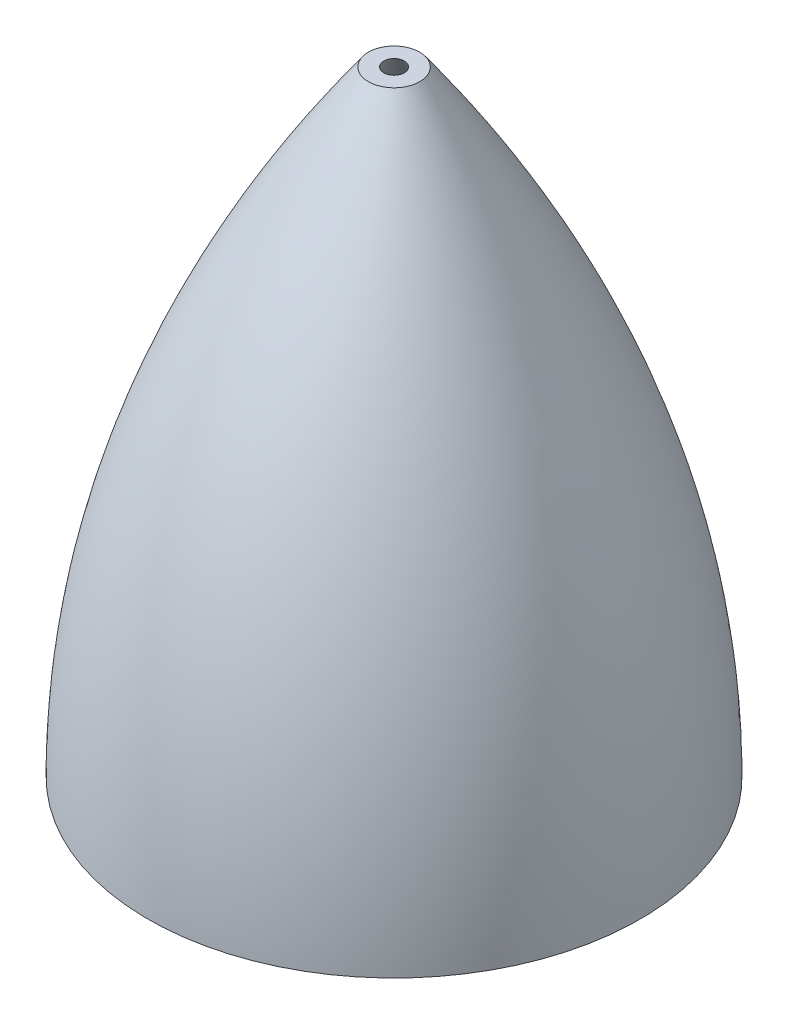
ISO-10303-21;
HEADER;
FILE_DESCRIPTION(('STEP AP214'),'2;1');
FILE_NAME('part.step','',(''),(''),'','','');
FILE_SCHEMA(('AUTOMOTIVE_DESIGN { 1 0 10303 214 1 1 1 1 }'));
ENDSEC;
DATA;
#1=APPLICATION_CONTEXT('core data for automotive mechanical design processes');
#2=APPLICATION_PROTOCOL_DEFINITION('international standard','automotive_design',2000,#1);
#3=PRODUCT_CONTEXT('',#1,'mechanical');
#4=PRODUCT('Part','Part','',(#3));
#5=PRODUCT_RELATED_PRODUCT_CATEGORY('part','',(#4));
#6=PRODUCT_DEFINITION_FORMATION('','',#4);
#7=PRODUCT_DEFINITION_CONTEXT('part definition',#1,'design');
#8=PRODUCT_DEFINITION('design','',#6,#7);
#9=PRODUCT_DEFINITION_SHAPE('','',#8);
#10=(LENGTH_UNIT() NAMED_UNIT(*) SI_UNIT(.MILLI.,.METRE.));
#11=(NAMED_UNIT(*) PLANE_ANGLE_UNIT() SI_UNIT($,.RADIAN.));
#12=(NAMED_UNIT(*) SI_UNIT($,.STERADIAN.) SOLID_ANGLE_UNIT());
#13=UNCERTAINTY_MEASURE_WITH_UNIT(LENGTH_MEASURE(1.E-05),#10,'distance_accuracy_value','');
#14=(GEOMETRIC_REPRESENTATION_CONTEXT(3) GLOBAL_UNCERTAINTY_ASSIGNED_CONTEXT((#13)) GLOBAL_UNIT_ASSIGNED_CONTEXT((#10,
#11,#12)) REPRESENTATION_CONTEXT('',''));
#15=CARTESIAN_POINT('',(0.,0.,0.));
#16=DIRECTION('',(0.,0.,1.));
#17=DIRECTION('',(1.,0.,0.));
#18=AXIS2_PLACEMENT_3D('',#15,#16,#17);
#19=CARTESIAN_POINT('',(1.99999999999936,120.,0.));
#20=CARTESIAN_POINT('',(44.9999999999997,60.,0.));
#21=CARTESIAN_POINT('',(45.,0.,0.));
#22=B_SPLINE_CURVE_WITH_KNOTS('',2,(#19,#20,#21),.UNSPECIFIED.,.F.,.F.,(3,3),(0.,1.),.UNSPECIFIED.);
#23=CARTESIAN_POINT('',(-3.19189119579733E-13,120.,0.));
#24=DIRECTION('',(0.,1.,0.));
#25=AXIS1_PLACEMENT('',#23,#24);
#26=SURFACE_OF_REVOLUTION('',#22,#25);
#27=CARTESIAN_POINT('',(0.,-1.38777878078145E-13,0.));
#28=DIRECTION('',(0.,1.,0.));
#29=DIRECTION('',(-1.,0.,0.));
#30=AXIS2_PLACEMENT_3D('',#27,#28,#29);
#31=CIRCLE('',#30,45.);
#32=CARTESIAN_POINT('',(-45.,-2.58473797920544E-13,0.));
#33=VERTEX_POINT('',#32);
#34=EDGE_CURVE('E56',#33,#33,#31,.T.);
#35=ORIENTED_EDGE('',*,*,#34,.F.);
#36=EDGE_LOOP('',(#35));
#37=FACE_BOUND('',#36,.T.);
#38=CARTESIAN_POINT('',(-3.19189119579733E-13,120.,0.));
#39=DIRECTION('',(0.,1.,0.));
#40=DIRECTION('',(-1.,0.,0.));
#41=AXIS2_PLACEMENT_3D('',#38,#39,#40);
#42=CIRCLE('',#41,2.);
#43=CARTESIAN_POINT('',(-2.00000000000032,120.,0.));
#44=VERTEX_POINT('',#43);
#45=EDGE_CURVE('E10',#44,#44,#42,.T.);
#46=ORIENTED_EDGE('',*,*,#45,.T.);
#47=EDGE_LOOP('',(#46));
#48=FACE_BOUND('',#47,.T.);
#49=ADVANCED_FACE('F41',(#37,#48),#26,.T.);
#50=CARTESIAN_POINT('',(5.,120.,0.));
#51=DIRECTION('',(0.,-1.,0.));
#52=DIRECTION('',(1.,0.,0.));
#53=AXIS2_PLACEMENT_3D('',#50,#51,#52);
#54=PLANE('',#53);
#55=ORIENTED_EDGE('',*,*,#45,.F.);
#56=EDGE_LOOP('',(#55));
#57=FACE_BOUND('',#56,.T.);
#58=CARTESIAN_POINT('',(-3.19189119579732E-13,120.,0.));
#59=DIRECTION('',(0.,1.,0.));
#60=DIRECTION('',(-1.,0.,0.));
#61=AXIS2_PLACEMENT_3D('',#58,#59,#60);
#62=CIRCLE('',#61,5.00000000000032);
#63=CARTESIAN_POINT('',(-5.00000000000064,120.,0.));
#64=VERTEX_POINT('',#63);
#65=EDGE_CURVE('E48',#64,#64,#62,.T.);
#66=ORIENTED_EDGE('',*,*,#65,.T.);
#67=EDGE_LOOP('',(#66));
#68=FACE_BOUND('',#67,.T.);
#69=ADVANCED_FACE('F75',(#57,#68),#54,.F.);
#70=CARTESIAN_POINT('',(48.,0.,0.));
#71=CARTESIAN_POINT('',(48.,60.,0.));
#72=CARTESIAN_POINT('',(5.,120.,0.));
#73=B_SPLINE_CURVE_WITH_KNOTS('',2,(#70,#71,#72),.UNSPECIFIED.,.F.,.F.,(3,3),(0.,1.),.UNSPECIFIED.);
#74=CARTESIAN_POINT('',(-3.19189119579733E-13,120.,0.));
#75=DIRECTION('',(0.,1.,0.));
#76=AXIS1_PLACEMENT('',#74,#75);
#77=SURFACE_OF_REVOLUTION('',#73,#76);
#78=ORIENTED_EDGE('',*,*,#65,.F.);
#79=EDGE_LOOP('',(#78));
#80=FACE_BOUND('',#79,.T.);
#81=CARTESIAN_POINT('',(0.,-1.2490009027033E-13,0.));
#82=DIRECTION('',(0.,1.,0.));
#83=DIRECTION('',(-1.,0.,0.));
#84=AXIS2_PLACEMENT_3D('',#81,#82,#83);
#85=CIRCLE('',#84,48.);
#86=CARTESIAN_POINT('',(-48.,-2.52575738102223E-13,0.));
#87=VERTEX_POINT('',#86);
#88=EDGE_CURVE('E52',#87,#87,#85,.T.);
#89=ORIENTED_EDGE('',*,*,#88,.T.);
#90=EDGE_LOOP('',(#89));
#91=FACE_BOUND('',#90,.T.);
#92=ADVANCED_FACE('F71',(#80,#91),#77,.T.);
#93=CARTESIAN_POINT('',(48.,0.,0.));
#94=DIRECTION('',(0.,1.,0.));
#95=DIRECTION('',(-1.,0.,0.));
#96=AXIS2_PLACEMENT_3D('',#93,#94,#95);
#97=PLANE('',#96);
#98=ORIENTED_EDGE('',*,*,#88,.F.);
#99=EDGE_LOOP('',(#98));
#100=FACE_BOUND('',#99,.T.);
#101=ORIENTED_EDGE('',*,*,#34,.T.);
#102=EDGE_LOOP('',(#101));
#103=FACE_BOUND('',#102,.T.);
#104=ADVANCED_FACE('F74',(#100,#103),#97,.F.);
#105=CLOSED_SHELL('',(#49,#69,#92,#104));
#106=MANIFOLD_SOLID_BREP('B2',#105);
#107=ADVANCED_BREP_SHAPE_REPRESENTATION('',(#18,#106),#14);
#108=SHAPE_DEFINITION_REPRESENTATION(#9,#107);
ENDSEC;
END-ISO-10303-21;
